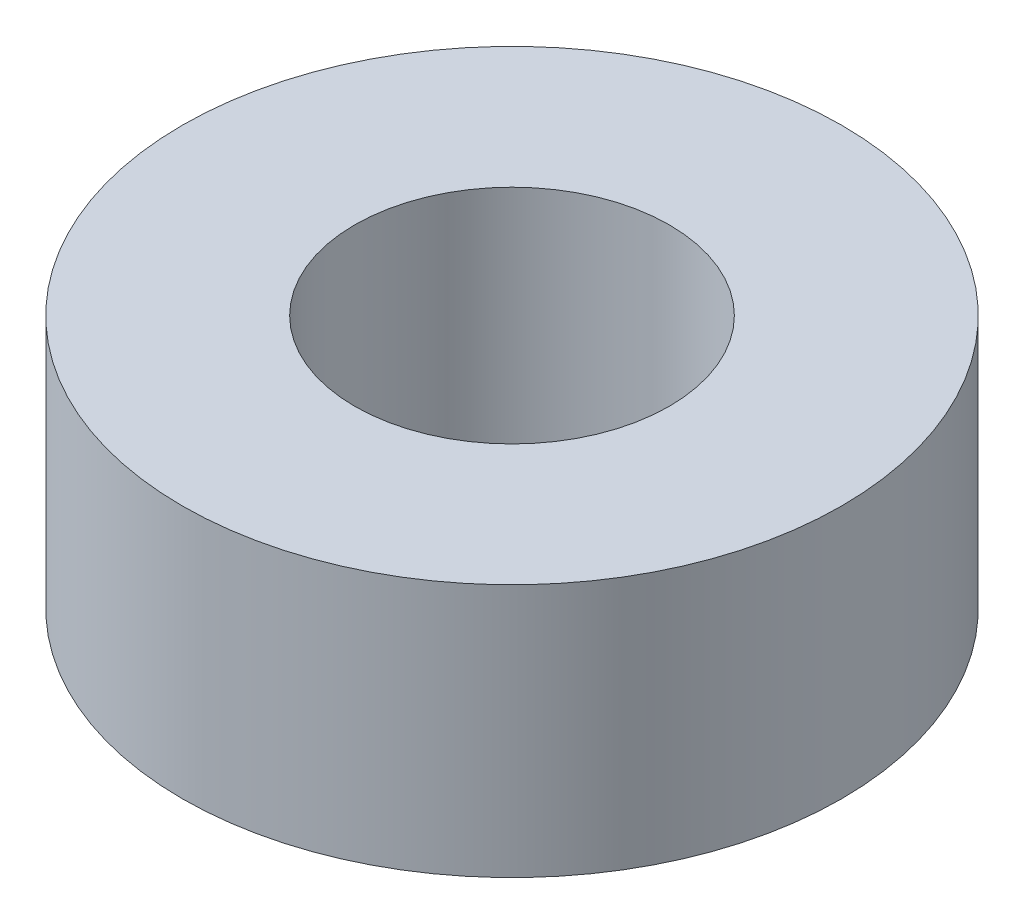
ISO-10303-21;
HEADER;
FILE_DESCRIPTION(('STEP AP214'),'2;1');
FILE_NAME('part.step','',(''),(''),'','','');
FILE_SCHEMA(('AUTOMOTIVE_DESIGN { 1 0 10303 214 1 1 1 1 }'));
ENDSEC;
DATA;
#1=APPLICATION_CONTEXT('core data for automotive mechanical design processes');
#2=APPLICATION_PROTOCOL_DEFINITION('international standard','automotive_design',2000,#1);
#3=PRODUCT_CONTEXT('',#1,'mechanical');
#4=PRODUCT('Part','Part','',(#3));
#5=PRODUCT_RELATED_PRODUCT_CATEGORY('part','',(#4));
#6=PRODUCT_DEFINITION_FORMATION('','',#4);
#7=PRODUCT_DEFINITION_CONTEXT('part definition',#1,'design');
#8=PRODUCT_DEFINITION('design','',#6,#7);
#9=PRODUCT_DEFINITION_SHAPE('','',#8);
#10=(LENGTH_UNIT() NAMED_UNIT(*) SI_UNIT(.MILLI.,.METRE.));
#11=(NAMED_UNIT(*) PLANE_ANGLE_UNIT() SI_UNIT($,.RADIAN.));
#12=(NAMED_UNIT(*) SI_UNIT($,.STERADIAN.) SOLID_ANGLE_UNIT());
#13=UNCERTAINTY_MEASURE_WITH_UNIT(LENGTH_MEASURE(1.E-05),#10,'distance_accuracy_value','');
#14=(GEOMETRIC_REPRESENTATION_CONTEXT(3) GLOBAL_UNCERTAINTY_ASSIGNED_CONTEXT((#13)) GLOBAL_UNIT_ASSIGNED_CONTEXT((#10,
#11,#12)) REPRESENTATION_CONTEXT('',''));
#15=CARTESIAN_POINT('',(0.,0.,0.));
#16=DIRECTION('',(0.,0.,1.));
#17=DIRECTION('',(1.,0.,0.));
#18=AXIS2_PLACEMENT_3D('',#15,#16,#17);
#19=CARTESIAN_POINT('',(0.,10.,0.));
#20=DIRECTION('',(0.,1.,0.));
#21=DIRECTION('',(0.,0.,1.));
#22=AXIS2_PLACEMENT_3D('',#19,#20,#21);
#23=PLANE('',#22);
#24=CARTESIAN_POINT('',(0.,10.,0.));
#25=DIRECTION('',(0.,1.,0.));
#26=DIRECTION('',(0.,0.,1.));
#27=AXIS2_PLACEMENT_3D('',#24,#25,#26);
#28=CIRCLE('',#27,13.);
#29=CARTESIAN_POINT('',(0.,10.,13.));
#30=VERTEX_POINT('',#29);
#31=EDGE_CURVE('E10',#30,#30,#28,.T.);
#32=ORIENTED_EDGE('',*,*,#31,.T.);
#33=EDGE_LOOP('',(#32));
#34=FACE_BOUND('',#33,.T.);
#35=CARTESIAN_POINT('',(0.,10.,0.));
#36=DIRECTION('',(0.,1.,0.));
#37=DIRECTION('',(0.,0.,1.));
#38=AXIS2_PLACEMENT_3D('',#35,#36,#37);
#39=CIRCLE('',#38,6.2);
#40=CARTESIAN_POINT('',(0.,10.,6.2));
#41=VERTEX_POINT('',#40);
#42=EDGE_CURVE('E42',#41,#41,#39,.T.);
#43=ORIENTED_EDGE('',*,*,#42,.F.);
#44=EDGE_LOOP('',(#43));
#45=FACE_BOUND('',#44,.T.);
#46=ADVANCED_FACE('F31',(#34,#45),#23,.T.);
#47=CARTESIAN_POINT('',(0.,0.,0.));
#48=DIRECTION('',(0.,1.,0.));
#49=DIRECTION('',(0.,0.,1.));
#50=AXIS2_PLACEMENT_3D('',#47,#48,#49);
#51=PLANE('',#50);
#52=CARTESIAN_POINT('',(0.,0.,0.));
#53=DIRECTION('',(0.,1.,0.));
#54=DIRECTION('',(0.,0.,1.));
#55=AXIS2_PLACEMENT_3D('',#52,#53,#54);
#56=CIRCLE('',#55,13.);
#57=CARTESIAN_POINT('',(0.,0.,13.));
#58=VERTEX_POINT('',#57);
#59=EDGE_CURVE('E35',#58,#58,#56,.T.);
#60=ORIENTED_EDGE('',*,*,#59,.F.);
#61=EDGE_LOOP('',(#60));
#62=FACE_BOUND('',#61,.T.);
#63=CARTESIAN_POINT('',(0.,0.,0.));
#64=DIRECTION('',(0.,1.,0.));
#65=DIRECTION('',(0.,0.,1.));
#66=AXIS2_PLACEMENT_3D('',#63,#64,#65);
#67=CIRCLE('',#66,6.2);
#68=CARTESIAN_POINT('',(0.,0.,6.2));
#69=VERTEX_POINT('',#68);
#70=EDGE_CURVE('E44',#69,#69,#67,.T.);
#71=ORIENTED_EDGE('',*,*,#70,.T.);
#72=EDGE_LOOP('',(#71));
#73=FACE_BOUND('',#72,.T.);
#74=ADVANCED_FACE('F54',(#62,#73),#51,.F.);
#75=CARTESIAN_POINT('',(0.,10.,0.));
#76=DIRECTION('',(0.,-1.,0.));
#77=DIRECTION('',(0.,0.,-1.));
#78=AXIS2_PLACEMENT_3D('',#75,#76,#77);
#79=CYLINDRICAL_SURFACE('',#78,13.);
#80=ORIENTED_EDGE('',*,*,#31,.F.);
#81=EDGE_LOOP('',(#80));
#82=FACE_BOUND('',#81,.T.);
#83=ORIENTED_EDGE('',*,*,#59,.T.);
#84=EDGE_LOOP('',(#83));
#85=FACE_BOUND('',#84,.T.);
#86=ADVANCED_FACE('F33',(#82,#85),#79,.T.);
#87=CARTESIAN_POINT('',(0.,10.,0.));
#88=DIRECTION('',(0.,-1.,0.));
#89=DIRECTION('',(0.,0.,-1.));
#90=AXIS2_PLACEMENT_3D('',#87,#88,#89);
#91=CYLINDRICAL_SURFACE('',#90,6.2);
#92=ORIENTED_EDGE('',*,*,#42,.T.);
#93=EDGE_LOOP('',(#92));
#94=FACE_BOUND('',#93,.T.);
#95=ORIENTED_EDGE('',*,*,#70,.F.);
#96=EDGE_LOOP('',(#95));
#97=FACE_BOUND('',#96,.T.);
#98=ADVANCED_FACE('F50',(#94,#97),#91,.F.);
#99=CLOSED_SHELL('',(#46,#74,#86,#98));
#100=MANIFOLD_SOLID_BREP('B2',#99);
#101=ADVANCED_BREP_SHAPE_REPRESENTATION('',(#18,#100),#14);
#102=SHAPE_DEFINITION_REPRESENTATION(#9,#101);
ENDSEC;
END-ISO-10303-21;
